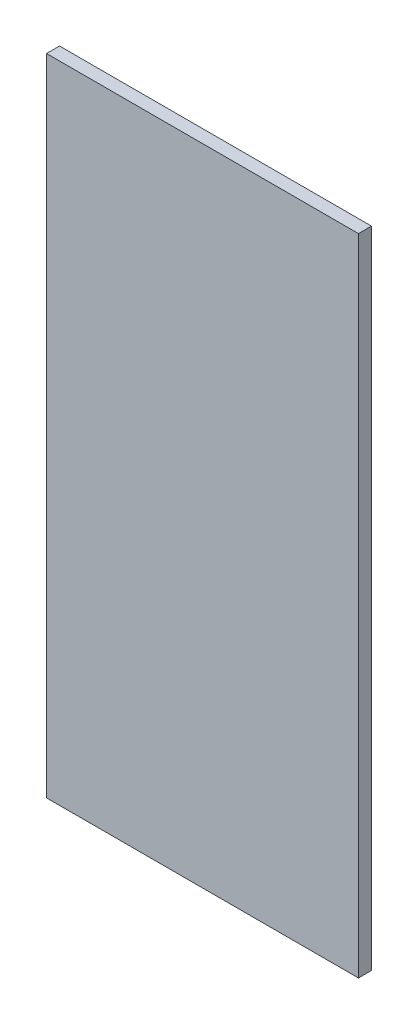
ISO-10303-21;
HEADER;
FILE_DESCRIPTION(('STEP AP214'),'2;1');
FILE_NAME('part.step','',(''),(''),'','','');
FILE_SCHEMA(('AUTOMOTIVE_DESIGN { 1 0 10303 214 1 1 1 1 }'));
ENDSEC;
DATA;
#1=APPLICATION_CONTEXT('core data for automotive mechanical design processes');
#2=APPLICATION_PROTOCOL_DEFINITION('international standard','automotive_design',2000,#1);
#3=PRODUCT_CONTEXT('',#1,'mechanical');
#4=PRODUCT('Part','Part','',(#3));
#5=PRODUCT_RELATED_PRODUCT_CATEGORY('part','',(#4));
#6=PRODUCT_DEFINITION_FORMATION('','',#4);
#7=PRODUCT_DEFINITION_CONTEXT('part definition',#1,'design');
#8=PRODUCT_DEFINITION('design','',#6,#7);
#9=PRODUCT_DEFINITION_SHAPE('','',#8);
#10=(LENGTH_UNIT() NAMED_UNIT(*) SI_UNIT(.MILLI.,.METRE.));
#11=(NAMED_UNIT(*) PLANE_ANGLE_UNIT() SI_UNIT($,.RADIAN.));
#12=(NAMED_UNIT(*) SI_UNIT($,.STERADIAN.) SOLID_ANGLE_UNIT());
#13=UNCERTAINTY_MEASURE_WITH_UNIT(LENGTH_MEASURE(1.E-05),#10,'distance_accuracy_value','');
#14=(GEOMETRIC_REPRESENTATION_CONTEXT(3) GLOBAL_UNCERTAINTY_ASSIGNED_CONTEXT((#13)) GLOBAL_UNIT_ASSIGNED_CONTEXT((#10,
#11,#12)) REPRESENTATION_CONTEXT('',''));
#15=CARTESIAN_POINT('',(0.,0.,0.));
#16=DIRECTION('',(0.,0.,1.));
#17=DIRECTION('',(1.,0.,0.));
#18=AXIS2_PLACEMENT_3D('',#15,#16,#17);
#19=CARTESIAN_POINT('',(76.2,157.48,6.35));
#20=DIRECTION('',(-1.,0.,0.));
#21=DIRECTION('',(0.,-1.,0.));
#22=AXIS2_PLACEMENT_3D('',#19,#20,#21);
#23=PLANE('',#22);
#24=DIRECTION('',(0.,1.,0.));
#25=VECTOR('',#24,1.);
#26=CARTESIAN_POINT('',(76.2,157.48,0.));
#27=LINE('',#26,#25);
#28=CARTESIAN_POINT('',(76.2,-157.48,0.));
#29=VERTEX_POINT('',#28);
#30=CARTESIAN_POINT('',(76.2,157.48,0.));
#31=VERTEX_POINT('',#30);
#32=EDGE_CURVE('E96',#29,#31,#27,.T.);
#33=ORIENTED_EDGE('',*,*,#32,.T.);
#34=DIRECTION('',(0.,0.,-1.));
#35=VECTOR('',#34,1.);
#36=CARTESIAN_POINT('',(76.2,157.48,6.35));
#37=LINE('',#36,#35);
#38=CARTESIAN_POINT('',(76.2,157.48,6.35));
#39=VERTEX_POINT('',#38);
#40=EDGE_CURVE('E11',#39,#31,#37,.T.);
#41=ORIENTED_EDGE('',*,*,#40,.F.);
#42=DIRECTION('',(0.,1.,0.));
#43=VECTOR('',#42,1.);
#44=CARTESIAN_POINT('',(76.2,157.48,6.35));
#45=LINE('',#44,#43);
#46=CARTESIAN_POINT('',(76.2,-157.48,6.35));
#47=VERTEX_POINT('',#46);
#48=EDGE_CURVE('E84',#47,#39,#45,.T.);
#49=ORIENTED_EDGE('',*,*,#48,.F.);
#50=DIRECTION('',(0.,0.,-1.));
#51=VECTOR('',#50,1.);
#52=CARTESIAN_POINT('',(76.2,-157.48,6.35));
#53=LINE('',#52,#51);
#54=EDGE_CURVE('E92',#47,#29,#53,.T.);
#55=ORIENTED_EDGE('',*,*,#54,.T.);
#56=EDGE_LOOP('',(#33,#41,#49,#55));
#57=FACE_BOUND('',#56,.T.);
#58=ADVANCED_FACE('F33',(#57),#23,.F.);
#59=CARTESIAN_POINT('',(-76.2,157.48,6.35));
#60=DIRECTION('',(0.,-1.,0.));
#61=DIRECTION('',(0.,0.,-1.));
#62=AXIS2_PLACEMENT_3D('',#59,#60,#61);
#63=PLANE('',#62);
#64=DIRECTION('',(-1.,0.,0.));
#65=VECTOR('',#64,1.);
#66=CARTESIAN_POINT('',(-76.2,157.48,0.));
#67=LINE('',#66,#65);
#68=CARTESIAN_POINT('',(-76.2,157.48,0.));
#69=VERTEX_POINT('',#68);
#70=EDGE_CURVE('E88',#31,#69,#67,.T.);
#71=ORIENTED_EDGE('',*,*,#70,.T.);
#72=DIRECTION('',(0.,0.,-1.));
#73=VECTOR('',#72,1.);
#74=CARTESIAN_POINT('',(-76.2,157.48,6.35));
#75=LINE('',#74,#73);
#76=CARTESIAN_POINT('',(-76.2,157.48,6.35));
#77=VERTEX_POINT('',#76);
#78=EDGE_CURVE('E41',#77,#69,#75,.T.);
#79=ORIENTED_EDGE('',*,*,#78,.F.);
#80=DIRECTION('',(-1.,0.,0.));
#81=VECTOR('',#80,1.);
#82=CARTESIAN_POINT('',(-76.2,157.48,6.35));
#83=LINE('',#82,#81);
#84=EDGE_CURVE('E79',#39,#77,#83,.T.);
#85=ORIENTED_EDGE('',*,*,#84,.F.);
#86=ORIENTED_EDGE('',*,*,#40,.T.);
#87=EDGE_LOOP('',(#71,#79,#85,#86));
#88=FACE_BOUND('',#87,.T.);
#89=ADVANCED_FACE('F87',(#88),#63,.F.);
#90=CARTESIAN_POINT('',(-76.2,157.48,6.35));
#91=DIRECTION('',(1.,0.,0.));
#92=DIRECTION('',(0.,1.,0.));
#93=AXIS2_PLACEMENT_3D('',#90,#91,#92);
#94=PLANE('',#93);
#95=DIRECTION('',(0.,-1.,0.));
#96=VECTOR('',#95,1.);
#97=CARTESIAN_POINT('',(-76.2,157.48,0.));
#98=LINE('',#97,#96);
#99=CARTESIAN_POINT('',(-76.2,-157.48,0.));
#100=VERTEX_POINT('',#99);
#101=EDGE_CURVE('E66',#69,#100,#98,.T.);
#102=ORIENTED_EDGE('',*,*,#101,.T.);
#103=DIRECTION('',(0.,0.,-1.));
#104=VECTOR('',#103,1.);
#105=CARTESIAN_POINT('',(-76.2,-157.48,6.35));
#106=LINE('',#105,#104);
#107=CARTESIAN_POINT('',(-76.2,-157.48,6.35));
#108=VERTEX_POINT('',#107);
#109=EDGE_CURVE('E89',#108,#100,#106,.T.);
#110=ORIENTED_EDGE('',*,*,#109,.F.);
#111=DIRECTION('',(0.,-1.,0.));
#112=VECTOR('',#111,1.);
#113=CARTESIAN_POINT('',(-76.2,157.48,6.35));
#114=LINE('',#113,#112);
#115=EDGE_CURVE('E82',#77,#108,#114,.T.);
#116=ORIENTED_EDGE('',*,*,#115,.F.);
#117=ORIENTED_EDGE('',*,*,#78,.T.);
#118=EDGE_LOOP('',(#102,#110,#116,#117));
#119=FACE_BOUND('',#118,.T.);
#120=ADVANCED_FACE('F90',(#119),#94,.F.);
#121=CARTESIAN_POINT('',(-76.2,-157.48,6.35));
#122=DIRECTION('',(0.,1.,0.));
#123=DIRECTION('',(0.,0.,1.));
#124=AXIS2_PLACEMENT_3D('',#121,#122,#123);
#125=PLANE('',#124);
#126=DIRECTION('',(1.,0.,0.));
#127=VECTOR('',#126,1.);
#128=CARTESIAN_POINT('',(-76.2,-157.48,0.));
#129=LINE('',#128,#127);
#130=EDGE_CURVE('E72',#100,#29,#129,.T.);
#131=ORIENTED_EDGE('',*,*,#130,.T.);
#132=ORIENTED_EDGE('',*,*,#54,.F.);
#133=DIRECTION('',(1.,0.,0.));
#134=VECTOR('',#133,1.);
#135=CARTESIAN_POINT('',(-76.2,-157.48,6.35));
#136=LINE('',#135,#134);
#137=EDGE_CURVE('E49',#108,#47,#136,.T.);
#138=ORIENTED_EDGE('',*,*,#137,.F.);
#139=ORIENTED_EDGE('',*,*,#109,.T.);
#140=EDGE_LOOP('',(#131,#132,#138,#139));
#141=FACE_BOUND('',#140,.T.);
#142=ADVANCED_FACE('F103',(#141),#125,.F.);
#143=CARTESIAN_POINT('',(0.,0.,6.35));
#144=DIRECTION('',(0.,0.,1.));
#145=DIRECTION('',(1.,0.,0.));
#146=AXIS2_PLACEMENT_3D('',#143,#144,#145);
#147=PLANE('',#146);
#148=ORIENTED_EDGE('',*,*,#48,.T.);
#149=ORIENTED_EDGE('',*,*,#84,.T.);
#150=ORIENTED_EDGE('',*,*,#115,.T.);
#151=ORIENTED_EDGE('',*,*,#137,.T.);
#152=EDGE_LOOP('',(#148,#149,#150,#151));
#153=FACE_BOUND('',#152,.T.);
#154=ADVANCED_FACE('F80',(#153),#147,.T.);
#155=CARTESIAN_POINT('',(0.,0.,0.));
#156=DIRECTION('',(0.,0.,1.));
#157=DIRECTION('',(1.,0.,0.));
#158=AXIS2_PLACEMENT_3D('',#155,#156,#157);
#159=PLANE('',#158);
#160=ORIENTED_EDGE('',*,*,#32,.F.);
#161=ORIENTED_EDGE('',*,*,#130,.F.);
#162=ORIENTED_EDGE('',*,*,#101,.F.);
#163=ORIENTED_EDGE('',*,*,#70,.F.);
#164=EDGE_LOOP('',(#160,#161,#162,#163));
#165=FACE_BOUND('',#164,.T.);
#166=ADVANCED_FACE('F106',(#165),#159,.F.);
#167=CLOSED_SHELL('',(#58,#89,#120,#142,#154,#166));
#168=MANIFOLD_SOLID_BREP('B2',#167);
#169=ADVANCED_BREP_SHAPE_REPRESENTATION('',(#18,#168),#14);
#170=SHAPE_DEFINITION_REPRESENTATION(#9,#169);
ENDSEC;
END-ISO-10303-21;
